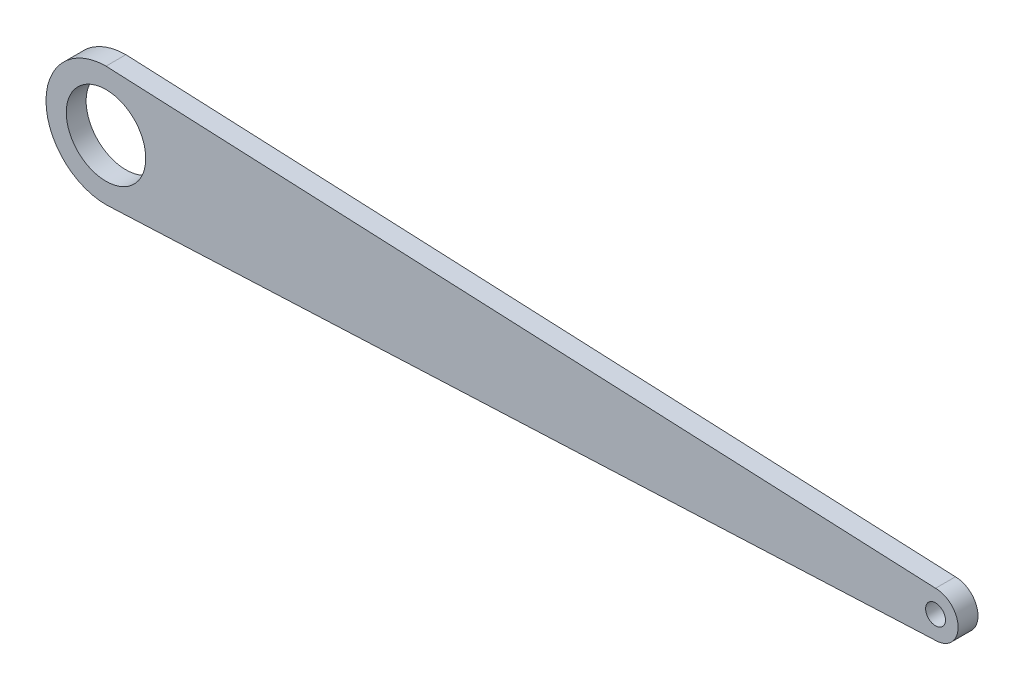
ISO-10303-21;
HEADER;
FILE_DESCRIPTION(('STEP AP214'),'2;1');
FILE_NAME('part.step','',(''),(''),'','','');
FILE_SCHEMA(('AUTOMOTIVE_DESIGN { 1 0 10303 214 1 1 1 1 }'));
ENDSEC;
DATA;
#1=APPLICATION_CONTEXT('core data for automotive mechanical design processes');
#2=APPLICATION_PROTOCOL_DEFINITION('international standard','automotive_design',2000,#1);
#3=PRODUCT_CONTEXT('',#1,'mechanical');
#4=PRODUCT('Part','Part','',(#3));
#5=PRODUCT_RELATED_PRODUCT_CATEGORY('part','',(#4));
#6=PRODUCT_DEFINITION_FORMATION('','',#4);
#7=PRODUCT_DEFINITION_CONTEXT('part definition',#1,'design');
#8=PRODUCT_DEFINITION('design','',#6,#7);
#9=PRODUCT_DEFINITION_SHAPE('','',#8);
#10=(LENGTH_UNIT() NAMED_UNIT(*) SI_UNIT(.MILLI.,.METRE.));
#11=(NAMED_UNIT(*) PLANE_ANGLE_UNIT() SI_UNIT($,.RADIAN.));
#12=(NAMED_UNIT(*) SI_UNIT($,.STERADIAN.) SOLID_ANGLE_UNIT());
#13=UNCERTAINTY_MEASURE_WITH_UNIT(LENGTH_MEASURE(1.E-05),#10,'distance_accuracy_value','');
#14=(GEOMETRIC_REPRESENTATION_CONTEXT(3) GLOBAL_UNCERTAINTY_ASSIGNED_CONTEXT((#13)) GLOBAL_UNIT_ASSIGNED_CONTEXT((#10,
#11,#12)) REPRESENTATION_CONTEXT('',''));
#15=CARTESIAN_POINT('',(0.,0.,0.));
#16=DIRECTION('',(0.,0.,1.));
#17=DIRECTION('',(1.,0.,0.));
#18=AXIS2_PLACEMENT_3D('',#15,#16,#17);
#19=CARTESIAN_POINT('',(173.713544973545,0.,5.));
#20=DIRECTION('',(0.,0.,-1.));
#21=DIRECTION('',(-1.,0.,0.));
#22=AXIS2_PLACEMENT_3D('',#19,#20,#21);
#23=PLANE('',#22);
#24=CARTESIAN_POINT('',(173.713544973545,0.,5.));
#25=DIRECTION('',(0.,0.,1.));
#26=DIRECTION('',(-1.,0.,0.));
#27=AXIS2_PLACEMENT_3D('',#24,#25,#26);
#28=CIRCLE('',#27,5.68510040342236);
#29=CARTESIAN_POINT('',(173.713544973545,-5.68510040342236,5.));
#30=VERTEX_POINT('',#29);
#31=CARTESIAN_POINT('',(173.713544973545,5.68510040342236,5.));
#32=VERTEX_POINT('',#31);
#33=EDGE_CURVE('E96',#30,#32,#28,.T.);
#34=ORIENTED_EDGE('',*,*,#33,.T.);
#35=DIRECTION('',(-0.998984647450412,0.0450519051581172,0.));
#36=VECTOR('',#35,1.);
#37=CARTESIAN_POINT('',(-35.026455026455,15.0987933032146,5.));
#38=LINE('',#37,#36);
#39=CARTESIAN_POINT('',(-35.026455026455,15.0987933032146,5.));
#40=VERTEX_POINT('',#39);
#41=EDGE_CURVE('E91',#32,#40,#38,.T.);
#42=ORIENTED_EDGE('',*,*,#41,.T.);
#43=CARTESIAN_POINT('',(-35.026455026455,0.,5.));
#44=DIRECTION('',(0.,0.,1.));
#45=DIRECTION('',(-1.,0.,0.));
#46=AXIS2_PLACEMENT_3D('',#43,#44,#45);
#47=CIRCLE('',#46,15.0987933032146);
#48=CARTESIAN_POINT('',(-35.026455026455,-15.0987933032146,5.));
#49=VERTEX_POINT('',#48);
#50=EDGE_CURVE('E94',#40,#49,#47,.T.);
#51=ORIENTED_EDGE('',*,*,#50,.T.);
#52=DIRECTION('',(0.998984647450412,0.0450519051581172,0.));
#53=VECTOR('',#52,1.);
#54=CARTESIAN_POINT('',(-35.026455026455,-15.0987933032146,5.));
#55=LINE('',#54,#53);
#56=EDGE_CURVE('E61',#49,#30,#55,.T.);
#57=ORIENTED_EDGE('',*,*,#56,.T.);
#58=EDGE_LOOP('',(#34,#42,#51,#57));
#59=FACE_BOUND('',#58,.T.);
#60=CARTESIAN_POINT('',(173.713544973545,0.,5.));
#61=DIRECTION('',(0.,0.,1.));
#62=DIRECTION('',(1.,0.,0.));
#63=AXIS2_PLACEMENT_3D('',#60,#61,#62);
#64=CIRCLE('',#63,2.5);
#65=CARTESIAN_POINT('',(176.213544973545,0.,5.));
#66=VERTEX_POINT('',#65);
#67=EDGE_CURVE('E116',#66,#66,#64,.T.);
#68=ORIENTED_EDGE('',*,*,#67,.F.);
#69=EDGE_LOOP('',(#68));
#70=FACE_BOUND('',#69,.T.);
#71=CARTESIAN_POINT('',(-35.026455026455,0.,5.));
#72=DIRECTION('',(0.,0.,1.));
#73=DIRECTION('',(1.,0.,0.));
#74=AXIS2_PLACEMENT_3D('',#71,#72,#73);
#75=CIRCLE('',#74,10.);
#76=CARTESIAN_POINT('',(-25.026455026455,0.,5.));
#77=VERTEX_POINT('',#76);
#78=EDGE_CURVE('E138',#77,#77,#75,.T.);
#79=ORIENTED_EDGE('',*,*,#78,.F.);
#80=EDGE_LOOP('',(#79));
#81=FACE_BOUND('',#80,.T.);
#82=ADVANCED_FACE('F43',(#59,#70,#81),#23,.F.);
#83=CARTESIAN_POINT('',(173.713544973545,0.,0.));
#84=DIRECTION('',(0.,0.,-1.));
#85=DIRECTION('',(-1.,0.,0.));
#86=AXIS2_PLACEMENT_3D('',#83,#84,#85);
#87=PLANE('',#86);
#88=CARTESIAN_POINT('',(173.713544973545,0.,0.));
#89=DIRECTION('',(0.,0.,1.));
#90=DIRECTION('',(1.,0.,0.));
#91=AXIS2_PLACEMENT_3D('',#88,#89,#90);
#92=CIRCLE('',#91,2.5);
#93=CARTESIAN_POINT('',(176.213544973545,0.,0.));
#94=VERTEX_POINT('',#93);
#95=EDGE_CURVE('E134',#94,#94,#92,.T.);
#96=ORIENTED_EDGE('',*,*,#95,.T.);
#97=EDGE_LOOP('',(#96));
#98=FACE_BOUND('',#97,.T.);
#99=CARTESIAN_POINT('',(173.713544973545,0.,0.));
#100=DIRECTION('',(0.,0.,1.));
#101=DIRECTION('',(-1.,0.,0.));
#102=AXIS2_PLACEMENT_3D('',#99,#100,#101);
#103=CIRCLE('',#102,5.68510040342236);
#104=CARTESIAN_POINT('',(173.713544973545,-5.68510040342236,0.));
#105=VERTEX_POINT('',#104);
#106=CARTESIAN_POINT('',(173.713544973545,5.68510040342236,0.));
#107=VERTEX_POINT('',#106);
#108=EDGE_CURVE('E112',#105,#107,#103,.T.);
#109=ORIENTED_EDGE('',*,*,#108,.F.);
#110=DIRECTION('',(0.998984647450412,0.0450519051581172,0.));
#111=VECTOR('',#110,1.);
#112=CARTESIAN_POINT('',(-35.026455026455,-15.0987933032146,0.));
#113=LINE('',#112,#111);
#114=CARTESIAN_POINT('',(-35.026455026455,-15.0987933032146,0.));
#115=VERTEX_POINT('',#114);
#116=EDGE_CURVE('E84',#115,#105,#113,.T.);
#117=ORIENTED_EDGE('',*,*,#116,.F.);
#118=CARTESIAN_POINT('',(-35.026455026455,0.,0.));
#119=DIRECTION('',(0.,0.,1.));
#120=DIRECTION('',(-1.,0.,0.));
#121=AXIS2_PLACEMENT_3D('',#118,#119,#120);
#122=CIRCLE('',#121,15.0987933032146);
#123=CARTESIAN_POINT('',(-35.026455026455,15.0987933032146,0.));
#124=VERTEX_POINT('',#123);
#125=EDGE_CURVE('E78',#124,#115,#122,.T.);
#126=ORIENTED_EDGE('',*,*,#125,.F.);
#127=DIRECTION('',(-0.998984647450412,0.0450519051581172,0.));
#128=VECTOR('',#127,1.);
#129=CARTESIAN_POINT('',(-35.026455026455,15.0987933032146,0.));
#130=LINE('',#129,#128);
#131=EDGE_CURVE('E101',#107,#124,#130,.T.);
#132=ORIENTED_EDGE('',*,*,#131,.F.);
#133=EDGE_LOOP('',(#109,#117,#126,#132));
#134=FACE_BOUND('',#133,.T.);
#135=CARTESIAN_POINT('',(-35.026455026455,0.,0.));
#136=DIRECTION('',(0.,0.,1.));
#137=DIRECTION('',(1.,0.,0.));
#138=AXIS2_PLACEMENT_3D('',#135,#136,#137);
#139=CIRCLE('',#138,10.);
#140=CARTESIAN_POINT('',(-25.026455026455,0.,0.));
#141=VERTEX_POINT('',#140);
#142=EDGE_CURVE('E142',#141,#141,#139,.T.);
#143=ORIENTED_EDGE('',*,*,#142,.T.);
#144=EDGE_LOOP('',(#143));
#145=FACE_BOUND('',#144,.T.);
#146=ADVANCED_FACE('F129',(#98,#134,#145),#87,.T.);
#147=CARTESIAN_POINT('',(173.713544973545,0.,5.));
#148=DIRECTION('',(0.,0.,-1.));
#149=DIRECTION('',(-1.,0.,0.));
#150=AXIS2_PLACEMENT_3D('',#147,#148,#149);
#151=CYLINDRICAL_SURFACE('',#150,5.68510040342236);
#152=ORIENTED_EDGE('',*,*,#108,.T.);
#153=DIRECTION('',(0.,0.,-1.));
#154=VECTOR('',#153,1.);
#155=CARTESIAN_POINT('',(173.713544973545,5.68510040342236,5.));
#156=LINE('',#155,#154);
#157=EDGE_CURVE('E11',#32,#107,#156,.T.);
#158=ORIENTED_EDGE('',*,*,#157,.F.);
#159=ORIENTED_EDGE('',*,*,#33,.F.);
#160=DIRECTION('',(0.,0.,-1.));
#161=VECTOR('',#160,1.);
#162=CARTESIAN_POINT('',(173.713544973545,-5.68510040342236,5.));
#163=LINE('',#162,#161);
#164=EDGE_CURVE('E108',#30,#105,#163,.T.);
#165=ORIENTED_EDGE('',*,*,#164,.T.);
#166=EDGE_LOOP('',(#152,#158,#159,#165));
#167=FACE_BOUND('',#166,.T.);
#168=ADVANCED_FACE('F45',(#167),#151,.T.);
#169=CARTESIAN_POINT('',(-35.026455026455,15.0987933032146,5.));
#170=DIRECTION('',(-0.0450519051581172,-0.998984647450412,0.));
#171=DIRECTION('',(0.998984647450412,-0.0450519051581172,0.));
#172=AXIS2_PLACEMENT_3D('',#169,#170,#171);
#173=PLANE('',#172);
#174=ORIENTED_EDGE('',*,*,#131,.T.);
#175=DIRECTION('',(0.,0.,-1.));
#176=VECTOR('',#175,1.);
#177=CARTESIAN_POINT('',(-35.026455026455,15.0987933032146,5.));
#178=LINE('',#177,#176);
#179=EDGE_CURVE('E53',#40,#124,#178,.T.);
#180=ORIENTED_EDGE('',*,*,#179,.F.);
#181=ORIENTED_EDGE('',*,*,#41,.F.);
#182=ORIENTED_EDGE('',*,*,#157,.T.);
#183=EDGE_LOOP('',(#174,#180,#181,#182));
#184=FACE_BOUND('',#183,.T.);
#185=ADVANCED_FACE('F100',(#184),#173,.F.);
#186=CARTESIAN_POINT('',(-35.026455026455,0.,5.));
#187=DIRECTION('',(0.,0.,-1.));
#188=DIRECTION('',(-1.,0.,0.));
#189=AXIS2_PLACEMENT_3D('',#186,#187,#188);
#190=CYLINDRICAL_SURFACE('',#189,15.0987933032146);
#191=ORIENTED_EDGE('',*,*,#125,.T.);
#192=DIRECTION('',(0.,0.,-1.));
#193=VECTOR('',#192,1.);
#194=CARTESIAN_POINT('',(-35.026455026455,-15.0987933032146,5.));
#195=LINE('',#194,#193);
#196=EDGE_CURVE('E103',#49,#115,#195,.T.);
#197=ORIENTED_EDGE('',*,*,#196,.F.);
#198=ORIENTED_EDGE('',*,*,#50,.F.);
#199=ORIENTED_EDGE('',*,*,#179,.T.);
#200=EDGE_LOOP('',(#191,#197,#198,#199));
#201=FACE_BOUND('',#200,.T.);
#202=ADVANCED_FACE('F104',(#201),#190,.T.);
#203=CARTESIAN_POINT('',(-35.026455026455,-15.0987933032146,5.));
#204=DIRECTION('',(-0.0450519051581172,0.998984647450412,0.));
#205=DIRECTION('',(-0.998984647450412,-0.0450519051581172,0.));
#206=AXIS2_PLACEMENT_3D('',#203,#204,#205);
#207=PLANE('',#206);
#208=ORIENTED_EDGE('',*,*,#116,.T.);
#209=ORIENTED_EDGE('',*,*,#164,.F.);
#210=ORIENTED_EDGE('',*,*,#56,.F.);
#211=ORIENTED_EDGE('',*,*,#196,.T.);
#212=EDGE_LOOP('',(#208,#209,#210,#211));
#213=FACE_BOUND('',#212,.T.);
#214=ADVANCED_FACE('F126',(#213),#207,.F.);
#215=CARTESIAN_POINT('',(173.713544973545,0.,5.));
#216=DIRECTION('',(0.,0.,-1.));
#217=DIRECTION('',(-1.,0.,0.));
#218=AXIS2_PLACEMENT_3D('',#215,#216,#217);
#219=CYLINDRICAL_SURFACE('',#218,2.5);
#220=ORIENTED_EDGE('',*,*,#67,.T.);
#221=EDGE_LOOP('',(#220));
#222=FACE_BOUND('',#221,.T.);
#223=ORIENTED_EDGE('',*,*,#95,.F.);
#224=EDGE_LOOP('',(#223));
#225=FACE_BOUND('',#224,.T.);
#226=ADVANCED_FACE('F161',(#222,#225),#219,.F.);
#227=CARTESIAN_POINT('',(-35.026455026455,0.,5.));
#228=DIRECTION('',(0.,0.,-1.));
#229=DIRECTION('',(-1.,0.,0.));
#230=AXIS2_PLACEMENT_3D('',#227,#228,#229);
#231=CYLINDRICAL_SURFACE('',#230,10.);
#232=ORIENTED_EDGE('',*,*,#78,.T.);
#233=EDGE_LOOP('',(#232));
#234=FACE_BOUND('',#233,.T.);
#235=ORIENTED_EDGE('',*,*,#142,.F.);
#236=EDGE_LOOP('',(#235));
#237=FACE_BOUND('',#236,.T.);
#238=ADVANCED_FACE('F150',(#234,#237),#231,.F.);
#239=CLOSED_SHELL('',(#82,#146,#168,#185,#202,#214,#226,#238));
#240=MANIFOLD_SOLID_BREP('B2',#239);
#241=ADVANCED_BREP_SHAPE_REPRESENTATION('',(#18,#240),#14);
#242=SHAPE_DEFINITION_REPRESENTATION(#9,#241);
ENDSEC;
END-ISO-10303-21;
